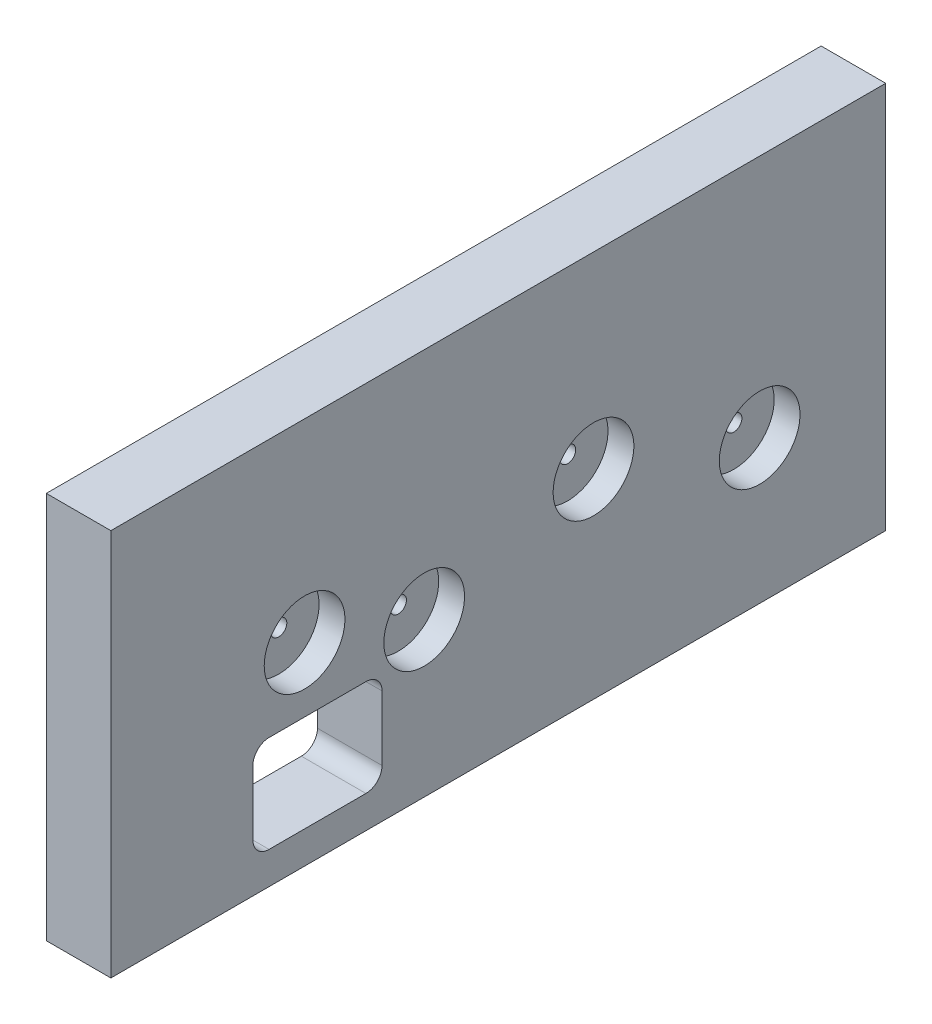
ISO-10303-21;
HEADER;
FILE_DESCRIPTION(('STEP AP214'),'2;1');
FILE_NAME('part.step','',(''),(''),'','','');
FILE_SCHEMA(('AUTOMOTIVE_DESIGN { 1 0 10303 214 1 1 1 1 }'));
ENDSEC;
DATA;
#1=APPLICATION_CONTEXT('core data for automotive mechanical design processes');
#2=APPLICATION_PROTOCOL_DEFINITION('international standard','automotive_design',2000,#1);
#3=PRODUCT_CONTEXT('',#1,'mechanical');
#4=PRODUCT('Part','Part','',(#3));
#5=PRODUCT_RELATED_PRODUCT_CATEGORY('part','',(#4));
#6=PRODUCT_DEFINITION_FORMATION('','',#4);
#7=PRODUCT_DEFINITION_CONTEXT('part definition',#1,'design');
#8=PRODUCT_DEFINITION('design','',#6,#7);
#9=PRODUCT_DEFINITION_SHAPE('','',#8);
#10=(LENGTH_UNIT() NAMED_UNIT(*) SI_UNIT(.MILLI.,.METRE.));
#11=(NAMED_UNIT(*) PLANE_ANGLE_UNIT() SI_UNIT($,.RADIAN.));
#12=(NAMED_UNIT(*) SI_UNIT($,.STERADIAN.) SOLID_ANGLE_UNIT());
#13=UNCERTAINTY_MEASURE_WITH_UNIT(LENGTH_MEASURE(1.E-05),#10,'distance_accuracy_value','');
#14=(GEOMETRIC_REPRESENTATION_CONTEXT(3) GLOBAL_UNCERTAINTY_ASSIGNED_CONTEXT((#13)) GLOBAL_UNIT_ASSIGNED_CONTEXT((#10,
#11,#12)) REPRESENTATION_CONTEXT('',''));
#15=CARTESIAN_POINT('',(0.,0.,0.));
#16=DIRECTION('',(0.,0.,1.));
#17=DIRECTION('',(1.,0.,0.));
#18=AXIS2_PLACEMENT_3D('',#15,#16,#17);
#19=CARTESIAN_POINT('',(12.7,-38.1,0.));
#20=DIRECTION('',(0.,1.,0.));
#21=DIRECTION('',(0.,0.,1.));
#22=AXIS2_PLACEMENT_3D('',#19,#20,#21);
#23=PLANE('',#22);
#24=CARTESIAN_POINT('',(6.35000000000001,-38.1,0.));
#25=DIRECTION('',(0.,-1.,0.));
#26=DIRECTION('',(0.,0.,-1.));
#27=AXIS2_PLACEMENT_3D('',#24,#25,#26);
#28=CIRCLE('',#27,3.175);
#29=CARTESIAN_POINT('',(6.35000000000001,-38.1,-3.175));
#30=VERTEX_POINT('',#29);
#31=EDGE_CURVE('E203',#30,#30,#28,.T.);
#32=ORIENTED_EDGE('',*,*,#31,.F.);
#33=EDGE_LOOP('',(#32));
#34=FACE_BOUND('',#33,.T.);
#35=CARTESIAN_POINT('',(6.35,-38.1,57.15));
#36=DIRECTION('',(0.,-1.,0.));
#37=DIRECTION('',(0.,0.,-1.));
#38=AXIS2_PLACEMENT_3D('',#35,#36,#37);
#39=CIRCLE('',#38,3.175);
#40=CARTESIAN_POINT('',(6.35,-38.1,53.975));
#41=VERTEX_POINT('',#40);
#42=EDGE_CURVE('E227',#41,#41,#39,.T.);
#43=ORIENTED_EDGE('',*,*,#42,.F.);
#44=EDGE_LOOP('',(#43));
#45=FACE_BOUND('',#44,.T.);
#46=CARTESIAN_POINT('',(6.35000000000002,-38.1,-63.5));
#47=DIRECTION('',(0.,-1.,0.));
#48=DIRECTION('',(0.,0.,-1.));
#49=AXIS2_PLACEMENT_3D('',#46,#47,#48);
#50=CIRCLE('',#49,3.175);
#51=CARTESIAN_POINT('',(6.35000000000002,-38.1,-66.675));
#52=VERTEX_POINT('',#51);
#53=EDGE_CURVE('E235',#52,#52,#50,.T.);
#54=ORIENTED_EDGE('',*,*,#53,.F.);
#55=EDGE_LOOP('',(#54));
#56=FACE_BOUND('',#55,.T.);
#57=DIRECTION('',(0.,0.,-1.));
#58=VECTOR('',#57,1.);
#59=CARTESIAN_POINT('',(0.,-38.1,0.));
#60=LINE('',#59,#58);
#61=CARTESIAN_POINT('',(0.,-38.1,76.2));
#62=VERTEX_POINT('',#61);
#63=CARTESIAN_POINT('',(0.,-38.1,-76.2));
#64=VERTEX_POINT('',#63);
#65=EDGE_CURVE('E293',#62,#64,#60,.T.);
#66=ORIENTED_EDGE('',*,*,#65,.T.);
#67=DIRECTION('',(-1.,0.,0.));
#68=VECTOR('',#67,1.);
#69=CARTESIAN_POINT('',(12.7,-38.1,-76.2));
#70=LINE('',#69,#68);
#71=CARTESIAN_POINT('',(12.7,-38.1,-76.2));
#72=VERTEX_POINT('',#71);
#73=EDGE_CURVE('E333',#72,#64,#70,.T.);
#74=ORIENTED_EDGE('',*,*,#73,.F.);
#75=DIRECTION('',(0.,0.,-1.));
#76=VECTOR('',#75,1.);
#77=CARTESIAN_POINT('',(12.7,-38.1,0.));
#78=LINE('',#77,#76);
#79=CARTESIAN_POINT('',(12.7,-38.1,76.2));
#80=VERTEX_POINT('',#79);
#81=EDGE_CURVE('E276',#80,#72,#78,.T.);
#82=ORIENTED_EDGE('',*,*,#81,.F.);
#83=DIRECTION('',(-1.,0.,0.));
#84=VECTOR('',#83,1.);
#85=CARTESIAN_POINT('',(12.7,-38.1,76.2));
#86=LINE('',#85,#84);
#87=EDGE_CURVE('E292',#80,#62,#86,.T.);
#88=ORIENTED_EDGE('',*,*,#87,.T.);
#89=EDGE_LOOP('',(#66,#74,#82,#88));
#90=FACE_BOUND('',#89,.T.);
#91=ADVANCED_FACE('F50',(#34,#45,#56,#90),#23,.F.);
#92=CARTESIAN_POINT('',(12.7,0.,-76.2));
#93=DIRECTION('',(0.,0.,1.));
#94=DIRECTION('',(1.,0.,0.));
#95=AXIS2_PLACEMENT_3D('',#92,#93,#94);
#96=PLANE('',#95);
#97=DIRECTION('',(0.,1.,0.));
#98=VECTOR('',#97,1.);
#99=CARTESIAN_POINT('',(0.,0.,-76.2));
#100=LINE('',#99,#98);
#101=CARTESIAN_POINT('',(0.,38.1,-76.2));
#102=VERTEX_POINT('',#101);
#103=EDGE_CURVE('E297',#64,#102,#100,.T.);
#104=ORIENTED_EDGE('',*,*,#103,.T.);
#105=DIRECTION('',(-1.,0.,0.));
#106=VECTOR('',#105,1.);
#107=CARTESIAN_POINT('',(12.7,38.1,-76.2));
#108=LINE('',#107,#106);
#109=CARTESIAN_POINT('',(12.7,38.1,-76.2));
#110=VERTEX_POINT('',#109);
#111=EDGE_CURVE('E330',#110,#102,#108,.T.);
#112=ORIENTED_EDGE('',*,*,#111,.F.);
#113=DIRECTION('',(0.,1.,0.));
#114=VECTOR('',#113,1.);
#115=CARTESIAN_POINT('',(12.7,0.,-76.2));
#116=LINE('',#115,#114);
#117=EDGE_CURVE('E280',#72,#110,#116,.T.);
#118=ORIENTED_EDGE('',*,*,#117,.F.);
#119=ORIENTED_EDGE('',*,*,#73,.T.);
#120=EDGE_LOOP('',(#104,#112,#118,#119));
#121=FACE_BOUND('',#120,.T.);
#122=ADVANCED_FACE('F411',(#121),#96,.F.);
#123=CARTESIAN_POINT('',(12.7,38.1,0.));
#124=DIRECTION('',(0.,1.,0.));
#125=DIRECTION('',(0.,0.,1.));
#126=AXIS2_PLACEMENT_3D('',#123,#124,#125);
#127=PLANE('',#126);
#128=DIRECTION('',(0.,0.,-1.));
#129=VECTOR('',#128,1.);
#130=CARTESIAN_POINT('',(0.,38.1,0.));
#131=LINE('',#130,#129);
#132=CARTESIAN_POINT('',(0.,38.1,76.2));
#133=VERTEX_POINT('',#132);
#134=EDGE_CURVE('E302',#133,#102,#131,.T.);
#135=ORIENTED_EDGE('',*,*,#134,.F.);
#136=DIRECTION('',(-1.,0.,0.));
#137=VECTOR('',#136,1.);
#138=CARTESIAN_POINT('',(12.7,38.1,76.2));
#139=LINE('',#138,#137);
#140=CARTESIAN_POINT('',(12.7,38.1,76.2));
#141=VERTEX_POINT('',#140);
#142=EDGE_CURVE('E327',#141,#133,#139,.T.);
#143=ORIENTED_EDGE('',*,*,#142,.F.);
#144=DIRECTION('',(0.,0.,-1.));
#145=VECTOR('',#144,1.);
#146=CARTESIAN_POINT('',(12.7,38.1,0.));
#147=LINE('',#146,#145);
#148=EDGE_CURVE('E284',#141,#110,#147,.T.);
#149=ORIENTED_EDGE('',*,*,#148,.T.);
#150=ORIENTED_EDGE('',*,*,#111,.T.);
#151=EDGE_LOOP('',(#135,#143,#149,#150));
#152=FACE_BOUND('',#151,.T.);
#153=ADVANCED_FACE('F417',(#152),#127,.T.);
#154=CARTESIAN_POINT('',(12.7,-9.873506971,-51.4082559918149));
#155=DIRECTION('',(-1.,0.,0.));
#156=DIRECTION('',(0.,0.,1.));
#157=AXIS2_PLACEMENT_3D('',#154,#155,#156);
#158=CYLINDRICAL_SURFACE('',#157,1.5875);
#159=CARTESIAN_POINT('',(7.62,-9.873506971,-51.4082559918149));
#160=DIRECTION('',(-1.,0.,0.));
#161=DIRECTION('',(0.,0.,1.));
#162=AXIS2_PLACEMENT_3D('',#159,#160,#161);
#163=CIRCLE('',#162,1.5875);
#164=CARTESIAN_POINT('',(7.62,-9.873506971,-49.8207559918149));
#165=VERTEX_POINT('',#164);
#166=EDGE_CURVE('E298',#165,#165,#163,.T.);
#167=ORIENTED_EDGE('',*,*,#166,.F.);
#168=EDGE_LOOP('',(#167));
#169=FACE_BOUND('',#168,.T.);
#170=CARTESIAN_POINT('',(0.,-9.873506971,-51.4082559918149));
#171=DIRECTION('',(1.,0.,0.));
#172=DIRECTION('',(0.,0.,-1.));
#173=AXIS2_PLACEMENT_3D('',#170,#171,#172);
#174=CIRCLE('',#173,1.5875);
#175=CARTESIAN_POINT('',(0.,-9.873506971,-52.9957559918149));
#176=VERTEX_POINT('',#175);
#177=EDGE_CURVE('E318',#176,#176,#174,.T.);
#178=ORIENTED_EDGE('',*,*,#177,.F.);
#179=EDGE_LOOP('',(#178));
#180=FACE_BOUND('',#179,.T.);
#181=ADVANCED_FACE('F451',(#169,#180),#158,.F.);
#182=CARTESIAN_POINT('',(12.7,1.096077429,-18.7225315801618));
#183=DIRECTION('',(-1.,0.,0.));
#184=DIRECTION('',(0.,0.,1.));
#185=AXIS2_PLACEMENT_3D('',#182,#183,#184);
#186=CYLINDRICAL_SURFACE('',#185,1.5875);
#187=CARTESIAN_POINT('',(7.62,1.096077429,-18.7225315801618));
#188=DIRECTION('',(-1.,0.,0.));
#189=DIRECTION('',(0.,0.,1.));
#190=AXIS2_PLACEMENT_3D('',#187,#188,#189);
#191=CIRCLE('',#190,1.5875);
#192=CARTESIAN_POINT('',(7.62,1.096077429,-17.1350315801618));
#193=VERTEX_POINT('',#192);
#194=EDGE_CURVE('E345',#193,#193,#191,.T.);
#195=ORIENTED_EDGE('',*,*,#194,.F.);
#196=EDGE_LOOP('',(#195));
#197=FACE_BOUND('',#196,.T.);
#198=CARTESIAN_POINT('',(0.,1.096077429,-18.7225315801618));
#199=DIRECTION('',(1.,0.,0.));
#200=DIRECTION('',(0.,0.,-1.));
#201=AXIS2_PLACEMENT_3D('',#198,#199,#200);
#202=CIRCLE('',#201,1.5875);
#203=CARTESIAN_POINT('',(0.,1.096077429,-20.3100315801618));
#204=VERTEX_POINT('',#203);
#205=EDGE_CURVE('E314',#204,#204,#202,.T.);
#206=ORIENTED_EDGE('',*,*,#205,.F.);
#207=EDGE_LOOP('',(#206));
#208=FACE_BOUND('',#207,.T.);
#209=ADVANCED_FACE('F454',(#197,#208),#186,.F.);
#210=CARTESIAN_POINT('',(12.7,0.,38.1));
#211=DIRECTION('',(-1.,0.,0.));
#212=DIRECTION('',(0.,0.,1.));
#213=AXIS2_PLACEMENT_3D('',#210,#211,#212);
#214=CYLINDRICAL_SURFACE('',#213,1.5875);
#215=CARTESIAN_POINT('',(7.62,0.,38.1));
#216=DIRECTION('',(-1.,0.,0.));
#217=DIRECTION('',(0.,0.,1.));
#218=AXIS2_PLACEMENT_3D('',#215,#216,#217);
#219=CIRCLE('',#218,1.5875);
#220=CARTESIAN_POINT('',(7.62,0.,39.6875));
#221=VERTEX_POINT('',#220);
#222=EDGE_CURVE('E341',#221,#221,#219,.T.);
#223=ORIENTED_EDGE('',*,*,#222,.F.);
#224=EDGE_LOOP('',(#223));
#225=FACE_BOUND('',#224,.T.);
#226=CARTESIAN_POINT('',(0.,0.,38.1));
#227=DIRECTION('',(1.,0.,0.));
#228=DIRECTION('',(0.,0.,-1.));
#229=AXIS2_PLACEMENT_3D('',#226,#227,#228);
#230=CIRCLE('',#229,1.5875);
#231=CARTESIAN_POINT('',(0.,0.,36.5125));
#232=VERTEX_POINT('',#231);
#233=EDGE_CURVE('E310',#232,#232,#230,.T.);
#234=ORIENTED_EDGE('',*,*,#233,.F.);
#235=EDGE_LOOP('',(#234));
#236=FACE_BOUND('',#235,.T.);
#237=ADVANCED_FACE('F458',(#225,#236),#214,.F.);
#238=CARTESIAN_POINT('',(12.7,0.,76.2));
#239=DIRECTION('',(0.,0.,1.));
#240=DIRECTION('',(1.,0.,0.));
#241=AXIS2_PLACEMENT_3D('',#238,#239,#240);
#242=PLANE('',#241);
#243=DIRECTION('',(0.,1.,0.));
#244=VECTOR('',#243,1.);
#245=CARTESIAN_POINT('',(0.,0.,76.2));
#246=LINE('',#245,#244);
#247=EDGE_CURVE('E306',#62,#133,#246,.T.);
#248=ORIENTED_EDGE('',*,*,#247,.F.);
#249=ORIENTED_EDGE('',*,*,#87,.F.);
#250=DIRECTION('',(0.,1.,0.));
#251=VECTOR('',#250,1.);
#252=CARTESIAN_POINT('',(12.7,0.,76.2));
#253=LINE('',#252,#251);
#254=EDGE_CURVE('E288',#80,#141,#253,.T.);
#255=ORIENTED_EDGE('',*,*,#254,.T.);
#256=ORIENTED_EDGE('',*,*,#142,.T.);
#257=EDGE_LOOP('',(#248,#249,#255,#256));
#258=FACE_BOUND('',#257,.T.);
#259=ADVANCED_FACE('F431',(#258),#242,.T.);
#260=CARTESIAN_POINT('',(12.7,-7.860160654,14.5712240149026));
#261=DIRECTION('',(-1.,0.,0.));
#262=DIRECTION('',(0.,0.,1.));
#263=AXIS2_PLACEMENT_3D('',#260,#261,#262);
#264=CYLINDRICAL_SURFACE('',#263,1.5875);
#265=CARTESIAN_POINT('',(7.62,-7.860160654,14.5712240149026));
#266=DIRECTION('',(-1.,0.,0.));
#267=DIRECTION('',(0.,0.,1.));
#268=AXIS2_PLACEMENT_3D('',#265,#266,#267);
#269=CIRCLE('',#268,1.5875);
#270=CARTESIAN_POINT('',(7.62,-7.860160654,16.1587240149026));
#271=VERTEX_POINT('',#270);
#272=EDGE_CURVE('E248',#271,#271,#269,.T.);
#273=ORIENTED_EDGE('',*,*,#272,.F.);
#274=EDGE_LOOP('',(#273));
#275=FACE_BOUND('',#274,.T.);
#276=CARTESIAN_POINT('',(0.,-7.860160654,14.5712240149026));
#277=DIRECTION('',(1.,0.,0.));
#278=DIRECTION('',(0.,0.,-1.));
#279=AXIS2_PLACEMENT_3D('',#276,#277,#278);
#280=CIRCLE('',#279,1.5875);
#281=CARTESIAN_POINT('',(0.,-7.860160654,12.9837240149026));
#282=VERTEX_POINT('',#281);
#283=EDGE_CURVE('E281',#282,#282,#280,.T.);
#284=ORIENTED_EDGE('',*,*,#283,.F.);
#285=EDGE_LOOP('',(#284));
#286=FACE_BOUND('',#285,.T.);
#287=ADVANCED_FACE('F438',(#275,#286),#264,.F.);
#288=CARTESIAN_POINT('',(12.7,0.,0.));
#289=DIRECTION('',(1.,0.,0.));
#290=DIRECTION('',(0.,0.,-1.));
#291=AXIS2_PLACEMENT_3D('',#288,#289,#290);
#292=PLANE('',#291);
#293=CARTESIAN_POINT('',(12.7,-28.575,26.035));
#294=DIRECTION('',(1.,0.,0.));
#295=DIRECTION('',(0.,0.,-1.));
#296=AXIS2_PLACEMENT_3D('',#293,#294,#295);
#297=CIRCLE('',#296,3.175);
#298=CARTESIAN_POINT('',(12.7,-31.75,26.035));
#299=VERTEX_POINT('',#298);
#300=CARTESIAN_POINT('',(12.7,-28.575,22.86));
#301=VERTEX_POINT('',#300);
#302=EDGE_CURVE('E65',#299,#301,#297,.T.);
#303=ORIENTED_EDGE('',*,*,#302,.F.);
#304=DIRECTION('',(0.,0.,-1.));
#305=VECTOR('',#304,1.);
#306=CARTESIAN_POINT('',(12.7,-31.75,45.085));
#307=LINE('',#306,#305);
#308=CARTESIAN_POINT('',(12.7,-31.75,45.085));
#309=VERTEX_POINT('',#308);
#310=EDGE_CURVE('E196',#309,#299,#307,.T.);
#311=ORIENTED_EDGE('',*,*,#310,.F.);
#312=CARTESIAN_POINT('',(12.7,-28.575,45.085));
#313=DIRECTION('',(1.,0.,0.));
#314=DIRECTION('',(0.,0.,-1.));
#315=AXIS2_PLACEMENT_3D('',#312,#313,#314);
#316=CIRCLE('',#315,3.175);
#317=CARTESIAN_POINT('',(12.7,-28.575,48.26));
#318=VERTEX_POINT('',#317);
#319=EDGE_CURVE('E192',#318,#309,#316,.T.);
#320=ORIENTED_EDGE('',*,*,#319,.F.);
#321=DIRECTION('',(0.,-1.,0.));
#322=VECTOR('',#321,1.);
#323=CARTESIAN_POINT('',(12.7,-15.875,48.26));
#324=LINE('',#323,#322);
#325=CARTESIAN_POINT('',(12.7,-15.875,48.26));
#326=VERTEX_POINT('',#325);
#327=EDGE_CURVE('E188',#326,#318,#324,.T.);
#328=ORIENTED_EDGE('',*,*,#327,.F.);
#329=CARTESIAN_POINT('',(12.7,-15.875,45.085));
#330=DIRECTION('',(1.,0.,0.));
#331=DIRECTION('',(0.,0.,-1.));
#332=AXIS2_PLACEMENT_3D('',#329,#330,#331);
#333=CIRCLE('',#332,3.175);
#334=CARTESIAN_POINT('',(12.7,-12.7,45.085));
#335=VERTEX_POINT('',#334);
#336=EDGE_CURVE('E181',#335,#326,#333,.T.);
#337=ORIENTED_EDGE('',*,*,#336,.F.);
#338=DIRECTION('',(0.,0.,1.));
#339=VECTOR('',#338,1.);
#340=CARTESIAN_POINT('',(12.7,-12.7,45.085));
#341=LINE('',#340,#339);
#342=CARTESIAN_POINT('',(12.7,-12.7,26.035));
#343=VERTEX_POINT('',#342);
#344=EDGE_CURVE('E177',#343,#335,#341,.T.);
#345=ORIENTED_EDGE('',*,*,#344,.F.);
#346=CARTESIAN_POINT('',(12.7,-15.875,26.035));
#347=DIRECTION('',(1.,0.,0.));
#348=DIRECTION('',(0.,0.,1.));
#349=AXIS2_PLACEMENT_3D('',#346,#347,#348);
#350=CIRCLE('',#349,3.175);
#351=CARTESIAN_POINT('',(12.7,-15.875,22.86));
#352=VERTEX_POINT('',#351);
#353=EDGE_CURVE('E158',#352,#343,#350,.T.);
#354=ORIENTED_EDGE('',*,*,#353,.F.);
#355=DIRECTION('',(0.,1.,0.));
#356=VECTOR('',#355,1.);
#357=CARTESIAN_POINT('',(12.7,-15.875,22.86));
#358=LINE('',#357,#356);
#359=EDGE_CURVE('E168',#301,#352,#358,.T.);
#360=ORIENTED_EDGE('',*,*,#359,.F.);
#361=EDGE_LOOP('',(#303,#311,#320,#328,#337,#345,#354,#360));
#362=FACE_BOUND('',#361,.T.);
#363=CARTESIAN_POINT('',(12.7,0.,38.1));
#364=DIRECTION('',(-1.,0.,0.));
#365=DIRECTION('',(0.,0.,1.));
#366=AXIS2_PLACEMENT_3D('',#363,#364,#365);
#367=CIRCLE('',#366,7.9375);
#368=CARTESIAN_POINT('',(12.7,0.,46.0375));
#369=VERTEX_POINT('',#368);
#370=EDGE_CURVE('E249',#369,#369,#367,.T.);
#371=ORIENTED_EDGE('',*,*,#370,.T.);
#372=EDGE_LOOP('',(#371));
#373=FACE_BOUND('',#372,.T.);
#374=CARTESIAN_POINT('',(12.7,-7.860160654,14.5712240149026));
#375=DIRECTION('',(-1.,0.,0.));
#376=DIRECTION('',(0.,0.,1.));
#377=AXIS2_PLACEMENT_3D('',#374,#375,#376);
#378=CIRCLE('',#377,7.9375);
#379=CARTESIAN_POINT('',(12.7,-7.860160654,22.5087240149026));
#380=VERTEX_POINT('',#379);
#381=EDGE_CURVE('E253',#380,#380,#378,.T.);
#382=ORIENTED_EDGE('',*,*,#381,.T.);
#383=EDGE_LOOP('',(#382));
#384=FACE_BOUND('',#383,.T.);
#385=CARTESIAN_POINT('',(12.7,1.096077429,-18.7225315801618));
#386=DIRECTION('',(-1.,0.,0.));
#387=DIRECTION('',(0.,0.,1.));
#388=AXIS2_PLACEMENT_3D('',#385,#386,#387);
#389=CIRCLE('',#388,7.9375);
#390=CARTESIAN_POINT('',(12.7,1.096077429,-10.7850315801618));
#391=VERTEX_POINT('',#390);
#392=EDGE_CURVE('E261',#391,#391,#389,.T.);
#393=ORIENTED_EDGE('',*,*,#392,.T.);
#394=EDGE_LOOP('',(#393));
#395=FACE_BOUND('',#394,.T.);
#396=CARTESIAN_POINT('',(12.7,-9.873506971,-51.4082559918149));
#397=DIRECTION('',(-1.,0.,0.));
#398=DIRECTION('',(0.,0.,1.));
#399=AXIS2_PLACEMENT_3D('',#396,#397,#398);
#400=CIRCLE('',#399,7.9375);
#401=CARTESIAN_POINT('',(12.7,-9.873506971,-43.4707559918149));
#402=VERTEX_POINT('',#401);
#403=EDGE_CURVE('E269',#402,#402,#400,.T.);
#404=ORIENTED_EDGE('',*,*,#403,.T.);
#405=EDGE_LOOP('',(#404));
#406=FACE_BOUND('',#405,.T.);
#407=ORIENTED_EDGE('',*,*,#81,.T.);
#408=ORIENTED_EDGE('',*,*,#117,.T.);
#409=ORIENTED_EDGE('',*,*,#148,.F.);
#410=ORIENTED_EDGE('',*,*,#254,.F.);
#411=EDGE_LOOP('',(#407,#408,#409,#410));
#412=FACE_BOUND('',#411,.T.);
#413=ADVANCED_FACE('F173',(#362,#373,#384,#395,#406,#412),#292,.T.);
#414=CARTESIAN_POINT('',(0.,0.,0.));
#415=DIRECTION('',(1.,0.,0.));
#416=DIRECTION('',(0.,0.,-1.));
#417=AXIS2_PLACEMENT_3D('',#414,#415,#416);
#418=PLANE('',#417);
#419=DIRECTION('',(0.,0.,-1.));
#420=VECTOR('',#419,1.);
#421=CARTESIAN_POINT('',(0.,-31.75,0.));
#422=LINE('',#421,#420);
#423=CARTESIAN_POINT('',(0.,-31.75,45.085));
#424=VERTEX_POINT('',#423);
#425=CARTESIAN_POINT('',(0.,-31.75,26.035));
#426=VERTEX_POINT('',#425);
#427=EDGE_CURVE('E58',#424,#426,#422,.T.);
#428=ORIENTED_EDGE('',*,*,#427,.T.);
#429=CARTESIAN_POINT('',(0.,-28.575,26.035));
#430=DIRECTION('',(1.,0.,0.));
#431=DIRECTION('',(0.,0.,-1.));
#432=AXIS2_PLACEMENT_3D('',#429,#430,#431);
#433=CIRCLE('',#432,3.175);
#434=CARTESIAN_POINT('',(0.,-28.575,22.86));
#435=VERTEX_POINT('',#434);
#436=EDGE_CURVE('E11',#426,#435,#433,.T.);
#437=ORIENTED_EDGE('',*,*,#436,.T.);
#438=DIRECTION('',(0.,1.,0.));
#439=VECTOR('',#438,1.);
#440=CARTESIAN_POINT('',(0.,0.,22.86));
#441=LINE('',#440,#439);
#442=CARTESIAN_POINT('',(0.,-15.875,22.86));
#443=VERTEX_POINT('',#442);
#444=EDGE_CURVE('E337',#435,#443,#441,.T.);
#445=ORIENTED_EDGE('',*,*,#444,.T.);
#446=CARTESIAN_POINT('',(0.,-15.875,26.035));
#447=DIRECTION('',(1.,0.,0.));
#448=DIRECTION('',(0.,0.,-1.));
#449=AXIS2_PLACEMENT_3D('',#446,#447,#448);
#450=CIRCLE('',#449,3.175);
#451=CARTESIAN_POINT('',(0.,-12.7,26.035));
#452=VERTEX_POINT('',#451);
#453=EDGE_CURVE('E161',#443,#452,#450,.T.);
#454=ORIENTED_EDGE('',*,*,#453,.T.);
#455=DIRECTION('',(0.,0.,1.));
#456=VECTOR('',#455,1.);
#457=CARTESIAN_POINT('',(0.,-12.7,0.));
#458=LINE('',#457,#456);
#459=CARTESIAN_POINT('',(0.,-12.7,45.085));
#460=VERTEX_POINT('',#459);
#461=EDGE_CURVE('E356',#452,#460,#458,.T.);
#462=ORIENTED_EDGE('',*,*,#461,.T.);
#463=CARTESIAN_POINT('',(0.,-15.875,45.085));
#464=DIRECTION('',(1.,0.,0.));
#465=DIRECTION('',(0.,0.,-1.));
#466=AXIS2_PLACEMENT_3D('',#463,#464,#465);
#467=CIRCLE('',#466,3.175);
#468=CARTESIAN_POINT('',(0.,-15.875,48.26));
#469=VERTEX_POINT('',#468);
#470=EDGE_CURVE('E360',#460,#469,#467,.T.);
#471=ORIENTED_EDGE('',*,*,#470,.T.);
#472=DIRECTION('',(0.,-1.,0.));
#473=VECTOR('',#472,1.);
#474=CARTESIAN_POINT('',(0.,0.,48.26));
#475=LINE('',#474,#473);
#476=CARTESIAN_POINT('',(0.,-28.575,48.26));
#477=VERTEX_POINT('',#476);
#478=EDGE_CURVE('E364',#469,#477,#475,.T.);
#479=ORIENTED_EDGE('',*,*,#478,.T.);
#480=CARTESIAN_POINT('',(0.,-28.575,45.085));
#481=DIRECTION('',(1.,0.,0.));
#482=DIRECTION('',(0.,0.,-1.));
#483=AXIS2_PLACEMENT_3D('',#480,#481,#482);
#484=CIRCLE('',#483,3.175);
#485=EDGE_CURVE('E368',#477,#424,#484,.T.);
#486=ORIENTED_EDGE('',*,*,#485,.T.);
#487=EDGE_LOOP('',(#428,#437,#445,#454,#462,#471,#479,#486));
#488=FACE_BOUND('',#487,.T.);
#489=ORIENTED_EDGE('',*,*,#65,.F.);
#490=ORIENTED_EDGE('',*,*,#247,.T.);
#491=ORIENTED_EDGE('',*,*,#134,.T.);
#492=ORIENTED_EDGE('',*,*,#103,.F.);
#493=EDGE_LOOP('',(#489,#490,#491,#492));
#494=FACE_BOUND('',#493,.T.);
#495=ORIENTED_EDGE('',*,*,#233,.T.);
#496=EDGE_LOOP('',(#495));
#497=FACE_BOUND('',#496,.T.);
#498=ORIENTED_EDGE('',*,*,#205,.T.);
#499=EDGE_LOOP('',(#498));
#500=FACE_BOUND('',#499,.T.);
#501=ORIENTED_EDGE('',*,*,#177,.T.);
#502=EDGE_LOOP('',(#501));
#503=FACE_BOUND('',#502,.T.);
#504=ORIENTED_EDGE('',*,*,#283,.T.);
#505=EDGE_LOOP('',(#504));
#506=FACE_BOUND('',#505,.T.);
#507=ADVANCED_FACE('F374',(#488,#494,#497,#500,#503,#506),#418,.F.);
#508=CARTESIAN_POINT('',(7.62,-9.873506971,-51.4082559918149));
#509=DIRECTION('',(1.,0.,0.));
#510=DIRECTION('',(0.,0.,-1.));
#511=AXIS2_PLACEMENT_3D('',#508,#509,#510);
#512=CYLINDRICAL_SURFACE('',#511,7.9375);
#513=CARTESIAN_POINT('',(7.62,-9.873506971,-51.4082559918149));
#514=DIRECTION('',(-1.,0.,0.));
#515=DIRECTION('',(0.,0.,1.));
#516=AXIS2_PLACEMENT_3D('',#513,#514,#515);
#517=CIRCLE('',#516,7.9375);
#518=CARTESIAN_POINT('',(7.62,-9.873506971,-43.4707559918149));
#519=VERTEX_POINT('',#518);
#520=EDGE_CURVE('E243',#519,#519,#517,.T.);
#521=ORIENTED_EDGE('',*,*,#520,.T.);
#522=EDGE_LOOP('',(#521));
#523=FACE_BOUND('',#522,.T.);
#524=ORIENTED_EDGE('',*,*,#403,.F.);
#525=EDGE_LOOP('',(#524));
#526=FACE_BOUND('',#525,.T.);
#527=ADVANCED_FACE('F442',(#523,#526),#512,.F.);
#528=CARTESIAN_POINT('',(7.62,-9.873506971,-51.4082559918149));
#529=DIRECTION('',(-1.,0.,0.));
#530=DIRECTION('',(0.,0.,1.));
#531=AXIS2_PLACEMENT_3D('',#528,#529,#530);
#532=PLANE('',#531);
#533=ORIENTED_EDGE('',*,*,#166,.T.);
#534=EDGE_LOOP('',(#533));
#535=FACE_BOUND('',#534,.T.);
#536=ORIENTED_EDGE('',*,*,#520,.F.);
#537=EDGE_LOOP('',(#536));
#538=FACE_BOUND('',#537,.T.);
#539=ADVANCED_FACE('F448',(#535,#538),#532,.F.);
#540=CARTESIAN_POINT('',(7.62,1.096077429,-18.7225315801618));
#541=DIRECTION('',(1.,0.,0.));
#542=DIRECTION('',(0.,0.,-1.));
#543=AXIS2_PLACEMENT_3D('',#540,#541,#542);
#544=CYLINDRICAL_SURFACE('',#543,7.9375);
#545=CARTESIAN_POINT('',(7.62,1.096077429,-18.7225315801618));
#546=DIRECTION('',(-1.,0.,0.));
#547=DIRECTION('',(0.,0.,1.));
#548=AXIS2_PLACEMENT_3D('',#545,#546,#547);
#549=CIRCLE('',#548,7.9375);
#550=CARTESIAN_POINT('',(7.62,1.096077429,-10.7850315801618));
#551=VERTEX_POINT('',#550);
#552=EDGE_CURVE('E265',#551,#551,#549,.T.);
#553=ORIENTED_EDGE('',*,*,#552,.T.);
#554=EDGE_LOOP('',(#553));
#555=FACE_BOUND('',#554,.T.);
#556=ORIENTED_EDGE('',*,*,#392,.F.);
#557=EDGE_LOOP('',(#556));
#558=FACE_BOUND('',#557,.T.);
#559=ADVANCED_FACE('F614',(#555,#558),#544,.F.);
#560=CARTESIAN_POINT('',(7.62,1.096077429,-18.7225315801618));
#561=DIRECTION('',(-1.,0.,0.));
#562=DIRECTION('',(0.,0.,1.));
#563=AXIS2_PLACEMENT_3D('',#560,#561,#562);
#564=PLANE('',#563);
#565=ORIENTED_EDGE('',*,*,#194,.T.);
#566=EDGE_LOOP('',(#565));
#567=FACE_BOUND('',#566,.T.);
#568=ORIENTED_EDGE('',*,*,#552,.F.);
#569=EDGE_LOOP('',(#568));
#570=FACE_BOUND('',#569,.T.);
#571=ADVANCED_FACE('F623',(#567,#570),#564,.F.);
#572=CARTESIAN_POINT('',(7.62,-7.860160654,14.5712240149026));
#573=DIRECTION('',(1.,0.,0.));
#574=DIRECTION('',(0.,0.,-1.));
#575=AXIS2_PLACEMENT_3D('',#572,#573,#574);
#576=CYLINDRICAL_SURFACE('',#575,7.9375);
#577=CARTESIAN_POINT('',(7.62,-7.860160654,14.5712240149026));
#578=DIRECTION('',(-1.,0.,0.));
#579=DIRECTION('',(0.,0.,1.));
#580=AXIS2_PLACEMENT_3D('',#577,#578,#579);
#581=CIRCLE('',#580,7.9375);
#582=CARTESIAN_POINT('',(7.62,-7.860160654,22.5087240149026));
#583=VERTEX_POINT('',#582);
#584=EDGE_CURVE('E257',#583,#583,#581,.T.);
#585=ORIENTED_EDGE('',*,*,#584,.T.);
#586=EDGE_LOOP('',(#585));
#587=FACE_BOUND('',#586,.T.);
#588=ORIENTED_EDGE('',*,*,#381,.F.);
#589=EDGE_LOOP('',(#588));
#590=FACE_BOUND('',#589,.T.);
#591=ADVANCED_FACE('F633',(#587,#590),#576,.F.);
#592=CARTESIAN_POINT('',(7.62,-7.860160654,14.5712240149026));
#593=DIRECTION('',(-1.,0.,0.));
#594=DIRECTION('',(0.,0.,1.));
#595=AXIS2_PLACEMENT_3D('',#592,#593,#594);
#596=PLANE('',#595);
#597=ORIENTED_EDGE('',*,*,#272,.T.);
#598=EDGE_LOOP('',(#597));
#599=FACE_BOUND('',#598,.T.);
#600=ORIENTED_EDGE('',*,*,#584,.F.);
#601=EDGE_LOOP('',(#600));
#602=FACE_BOUND('',#601,.T.);
#603=ADVANCED_FACE('F643',(#599,#602),#596,.F.);
#604=CARTESIAN_POINT('',(7.62,0.,38.1));
#605=DIRECTION('',(1.,0.,0.));
#606=DIRECTION('',(0.,0.,-1.));
#607=AXIS2_PLACEMENT_3D('',#604,#605,#606);
#608=CYLINDRICAL_SURFACE('',#607,7.9375);
#609=CARTESIAN_POINT('',(7.62,0.,38.1));
#610=DIRECTION('',(-1.,0.,0.));
#611=DIRECTION('',(0.,0.,1.));
#612=AXIS2_PLACEMENT_3D('',#609,#610,#611);
#613=CIRCLE('',#612,7.9375);
#614=CARTESIAN_POINT('',(7.62,0.,46.0375));
#615=VERTEX_POINT('',#614);
#616=EDGE_CURVE('E244',#615,#615,#613,.T.);
#617=ORIENTED_EDGE('',*,*,#616,.T.);
#618=EDGE_LOOP('',(#617));
#619=FACE_BOUND('',#618,.T.);
#620=ORIENTED_EDGE('',*,*,#370,.F.);
#621=EDGE_LOOP('',(#620));
#622=FACE_BOUND('',#621,.T.);
#623=ADVANCED_FACE('F653',(#619,#622),#608,.F.);
#624=CARTESIAN_POINT('',(7.62,0.,38.1));
#625=DIRECTION('',(-1.,0.,0.));
#626=DIRECTION('',(0.,0.,1.));
#627=AXIS2_PLACEMENT_3D('',#624,#625,#626);
#628=PLANE('',#627);
#629=ORIENTED_EDGE('',*,*,#222,.T.);
#630=EDGE_LOOP('',(#629));
#631=FACE_BOUND('',#630,.T.);
#632=ORIENTED_EDGE('',*,*,#616,.F.);
#633=EDGE_LOOP('',(#632));
#634=FACE_BOUND('',#633,.T.);
#635=ADVANCED_FACE('F663',(#631,#634),#628,.F.);
#636=CARTESIAN_POINT('',(6.35000000000002,0.,-63.5));
#637=DIRECTION('',(0.,-1.,0.));
#638=DIRECTION('',(0.,0.,-1.));
#639=AXIS2_PLACEMENT_3D('',#636,#637,#638);
#640=CONICAL_SURFACE('',#639,3.17499999999999,1.02974425867665);
#641=CARTESIAN_POINT('',(6.35000000000001,1.9077324654125,-63.5));
#642=VERTEX_POINT('',#641);
#643=VERTEX_LOOP('',#642);
#644=FACE_BOUND('',#643,.T.);
#645=CARTESIAN_POINT('',(6.35000000000002,0.,-63.5));
#646=DIRECTION('',(0.,-1.,0.));
#647=DIRECTION('',(0.,0.,-1.));
#648=AXIS2_PLACEMENT_3D('',#645,#646,#647);
#649=CIRCLE('',#648,3.17499999999999);
#650=CARTESIAN_POINT('',(6.35000000000002,0.,-66.675));
#651=VERTEX_POINT('',#650);
#652=EDGE_CURVE('E239',#651,#651,#649,.T.);
#653=ORIENTED_EDGE('',*,*,#652,.T.);
#654=EDGE_LOOP('',(#653));
#655=FACE_BOUND('',#654,.T.);
#656=ADVANCED_FACE('F673',(#644,#655),#640,.F.);
#657=CARTESIAN_POINT('',(6.35000000000002,-38.1,-63.5));
#658=DIRECTION('',(0.,-1.,0.));
#659=DIRECTION('',(0.,0.,-1.));
#660=AXIS2_PLACEMENT_3D('',#657,#658,#659);
#661=CYLINDRICAL_SURFACE('',#660,3.17499999999999);
#662=ORIENTED_EDGE('',*,*,#652,.F.);
#663=EDGE_LOOP('',(#662));
#664=FACE_BOUND('',#663,.T.);
#665=ORIENTED_EDGE('',*,*,#53,.T.);
#666=EDGE_LOOP('',(#665));
#667=FACE_BOUND('',#666,.T.);
#668=ADVANCED_FACE('F683',(#664,#667),#661,.F.);
#669=CARTESIAN_POINT('',(6.35,0.,57.15));
#670=DIRECTION('',(0.,-1.,0.));
#671=DIRECTION('',(0.,0.,-1.));
#672=AXIS2_PLACEMENT_3D('',#669,#670,#671);
#673=CONICAL_SURFACE('',#672,3.17499999999999,1.02974425867665);
#674=CARTESIAN_POINT('',(6.34999999999999,1.9077324654125,57.15));
#675=VERTEX_POINT('',#674);
#676=VERTEX_LOOP('',#675);
#677=FACE_BOUND('',#676,.T.);
#678=CARTESIAN_POINT('',(6.35,0.,57.15));
#679=DIRECTION('',(0.,-1.,0.));
#680=DIRECTION('',(0.,0.,-1.));
#681=AXIS2_PLACEMENT_3D('',#678,#679,#680);
#682=CIRCLE('',#681,3.17499999999999);
#683=CARTESIAN_POINT('',(6.35,0.,53.975));
#684=VERTEX_POINT('',#683);
#685=EDGE_CURVE('E231',#684,#684,#682,.T.);
#686=ORIENTED_EDGE('',*,*,#685,.T.);
#687=EDGE_LOOP('',(#686));
#688=FACE_BOUND('',#687,.T.);
#689=ADVANCED_FACE('F473',(#677,#688),#673,.F.);
#690=CARTESIAN_POINT('',(6.35,-38.1,57.15));
#691=DIRECTION('',(0.,-1.,0.));
#692=DIRECTION('',(0.,0.,-1.));
#693=AXIS2_PLACEMENT_3D('',#690,#691,#692);
#694=CYLINDRICAL_SURFACE('',#693,3.175);
#695=ORIENTED_EDGE('',*,*,#685,.F.);
#696=EDGE_LOOP('',(#695));
#697=FACE_BOUND('',#696,.T.);
#698=ORIENTED_EDGE('',*,*,#42,.T.);
#699=EDGE_LOOP('',(#698));
#700=FACE_BOUND('',#699,.T.);
#701=ADVANCED_FACE('F701',(#697,#700),#694,.F.);
#702=CARTESIAN_POINT('',(6.35000000000001,0.,0.));
#703=DIRECTION('',(0.,-1.,0.));
#704=DIRECTION('',(0.,0.,-1.));
#705=AXIS2_PLACEMENT_3D('',#702,#703,#704);
#706=CONICAL_SURFACE('',#705,3.17499999999999,1.02974425867665);
#707=CARTESIAN_POINT('',(6.35,1.9077324654125,0.));
#708=VERTEX_POINT('',#707);
#709=VERTEX_LOOP('',#708);
#710=FACE_BOUND('',#709,.T.);
#711=CARTESIAN_POINT('',(6.35000000000001,0.,0.));
#712=DIRECTION('',(0.,-1.,0.));
#713=DIRECTION('',(0.,0.,-1.));
#714=AXIS2_PLACEMENT_3D('',#711,#712,#713);
#715=CIRCLE('',#714,3.17499999999999);
#716=CARTESIAN_POINT('',(6.35000000000001,0.,-3.17499999999999));
#717=VERTEX_POINT('',#716);
#718=EDGE_CURVE('E223',#717,#717,#715,.T.);
#719=ORIENTED_EDGE('',*,*,#718,.T.);
#720=EDGE_LOOP('',(#719));
#721=FACE_BOUND('',#720,.T.);
#722=ADVANCED_FACE('F406',(#710,#721),#706,.F.);
#723=CARTESIAN_POINT('',(6.35000000000001,-38.1,0.));
#724=DIRECTION('',(0.,-1.,0.));
#725=DIRECTION('',(0.,0.,-1.));
#726=AXIS2_PLACEMENT_3D('',#723,#724,#725);
#727=CYLINDRICAL_SURFACE('',#726,3.175);
#728=ORIENTED_EDGE('',*,*,#718,.F.);
#729=EDGE_LOOP('',(#728));
#730=FACE_BOUND('',#729,.T.);
#731=ORIENTED_EDGE('',*,*,#31,.T.);
#732=EDGE_LOOP('',(#731));
#733=FACE_BOUND('',#732,.T.);
#734=ADVANCED_FACE('F397',(#730,#733),#727,.F.);
#735=CARTESIAN_POINT('',(-12.7,-28.575,26.035));
#736=DIRECTION('',(1.,0.,0.));
#737=DIRECTION('',(0.,0.,-1.));
#738=AXIS2_PLACEMENT_3D('',#735,#736,#737);
#739=CYLINDRICAL_SURFACE('',#738,3.175);
#740=DIRECTION('',(1.,0.,0.));
#741=VECTOR('',#740,1.);
#742=CARTESIAN_POINT('',(-12.7,-31.75,26.035));
#743=LINE('',#742,#741);
#744=EDGE_CURVE('E200',#426,#299,#743,.T.);
#745=ORIENTED_EDGE('',*,*,#744,.T.);
#746=ORIENTED_EDGE('',*,*,#302,.T.);
#747=DIRECTION('',(1.,0.,0.));
#748=VECTOR('',#747,1.);
#749=CARTESIAN_POINT('',(-12.7,-28.575,22.86));
#750=LINE('',#749,#748);
#751=EDGE_CURVE('E165',#435,#301,#750,.T.);
#752=ORIENTED_EDGE('',*,*,#751,.F.);
#753=ORIENTED_EDGE('',*,*,#436,.F.);
#754=EDGE_LOOP('',(#745,#746,#752,#753));
#755=FACE_BOUND('',#754,.T.);
#756=ADVANCED_FACE('F395',(#755),#739,.F.);
#757=CARTESIAN_POINT('',(-12.7,-31.75,45.085));
#758=DIRECTION('',(0.,-1.,0.));
#759=DIRECTION('',(0.,0.,-1.));
#760=AXIS2_PLACEMENT_3D('',#757,#758,#759);
#761=PLANE('',#760);
#762=DIRECTION('',(1.,0.,0.));
#763=VECTOR('',#762,1.);
#764=CARTESIAN_POINT('',(-12.7,-31.75,45.085));
#765=LINE('',#764,#763);
#766=EDGE_CURVE('E204',#424,#309,#765,.T.);
#767=ORIENTED_EDGE('',*,*,#766,.T.);
#768=ORIENTED_EDGE('',*,*,#310,.T.);
#769=ORIENTED_EDGE('',*,*,#744,.F.);
#770=ORIENTED_EDGE('',*,*,#427,.F.);
#771=EDGE_LOOP('',(#767,#768,#769,#770));
#772=FACE_BOUND('',#771,.T.);
#773=ADVANCED_FACE('F379',(#772),#761,.F.);
#774=CARTESIAN_POINT('',(-12.7,-28.575,45.085));
#775=DIRECTION('',(1.,0.,0.));
#776=DIRECTION('',(0.,0.,-1.));
#777=AXIS2_PLACEMENT_3D('',#774,#775,#776);
#778=CYLINDRICAL_SURFACE('',#777,3.175);
#779=DIRECTION('',(1.,0.,0.));
#780=VECTOR('',#779,1.);
#781=CARTESIAN_POINT('',(-12.7,-28.575,48.26));
#782=LINE('',#781,#780);
#783=EDGE_CURVE('E207',#477,#318,#782,.T.);
#784=ORIENTED_EDGE('',*,*,#783,.T.);
#785=ORIENTED_EDGE('',*,*,#319,.T.);
#786=ORIENTED_EDGE('',*,*,#766,.F.);
#787=ORIENTED_EDGE('',*,*,#485,.F.);
#788=EDGE_LOOP('',(#784,#785,#786,#787));
#789=FACE_BOUND('',#788,.T.);
#790=ADVANCED_FACE('F381',(#789),#778,.F.);
#791=CARTESIAN_POINT('',(-12.7,-15.875,48.26));
#792=DIRECTION('',(0.,0.,1.));
#793=DIRECTION('',(1.,0.,0.));
#794=AXIS2_PLACEMENT_3D('',#791,#792,#793);
#795=PLANE('',#794);
#796=DIRECTION('',(1.,0.,0.));
#797=VECTOR('',#796,1.);
#798=CARTESIAN_POINT('',(-12.7,-15.875,48.26));
#799=LINE('',#798,#797);
#800=EDGE_CURVE('E210',#469,#326,#799,.T.);
#801=ORIENTED_EDGE('',*,*,#800,.T.);
#802=ORIENTED_EDGE('',*,*,#327,.T.);
#803=ORIENTED_EDGE('',*,*,#783,.F.);
#804=ORIENTED_EDGE('',*,*,#478,.F.);
#805=EDGE_LOOP('',(#801,#802,#803,#804));
#806=FACE_BOUND('',#805,.T.);
#807=ADVANCED_FACE('F388',(#806),#795,.F.);
#808=CARTESIAN_POINT('',(-12.7,-15.875,45.085));
#809=DIRECTION('',(1.,0.,0.));
#810=DIRECTION('',(0.,0.,-1.));
#811=AXIS2_PLACEMENT_3D('',#808,#809,#810);
#812=CYLINDRICAL_SURFACE('',#811,3.175);
#813=DIRECTION('',(1.,0.,0.));
#814=VECTOR('',#813,1.);
#815=CARTESIAN_POINT('',(-12.7,-12.7,45.085));
#816=LINE('',#815,#814);
#817=EDGE_CURVE('E213',#460,#335,#816,.T.);
#818=ORIENTED_EDGE('',*,*,#817,.T.);
#819=ORIENTED_EDGE('',*,*,#336,.T.);
#820=ORIENTED_EDGE('',*,*,#800,.F.);
#821=ORIENTED_EDGE('',*,*,#470,.F.);
#822=EDGE_LOOP('',(#818,#819,#820,#821));
#823=FACE_BOUND('',#822,.T.);
#824=ADVANCED_FACE('F391',(#823),#812,.F.);
#825=CARTESIAN_POINT('',(-12.7,-12.7,45.085));
#826=DIRECTION('',(0.,1.,0.));
#827=DIRECTION('',(0.,0.,1.));
#828=AXIS2_PLACEMENT_3D('',#825,#826,#827);
#829=PLANE('',#828);
#830=DIRECTION('',(1.,0.,0.));
#831=VECTOR('',#830,1.);
#832=CARTESIAN_POINT('',(-12.7,-12.7,26.035));
#833=LINE('',#832,#831);
#834=EDGE_CURVE('E164',#452,#343,#833,.T.);
#835=ORIENTED_EDGE('',*,*,#834,.T.);
#836=ORIENTED_EDGE('',*,*,#344,.T.);
#837=ORIENTED_EDGE('',*,*,#817,.F.);
#838=ORIENTED_EDGE('',*,*,#461,.F.);
#839=EDGE_LOOP('',(#835,#836,#837,#838));
#840=FACE_BOUND('',#839,.T.);
#841=ADVANCED_FACE('F394',(#840),#829,.F.);
#842=CARTESIAN_POINT('',(-12.7,-15.875,26.035));
#843=DIRECTION('',(1.,0.,0.));
#844=DIRECTION('',(0.,0.,-1.));
#845=AXIS2_PLACEMENT_3D('',#842,#843,#844);
#846=CYLINDRICAL_SURFACE('',#845,3.175);
#847=DIRECTION('',(1.,0.,0.));
#848=VECTOR('',#847,1.);
#849=CARTESIAN_POINT('',(-12.7,-15.875,22.86));
#850=LINE('',#849,#848);
#851=EDGE_CURVE('E76',#443,#352,#850,.T.);
#852=ORIENTED_EDGE('',*,*,#851,.T.);
#853=ORIENTED_EDGE('',*,*,#353,.T.);
#854=ORIENTED_EDGE('',*,*,#834,.F.);
#855=ORIENTED_EDGE('',*,*,#453,.F.);
#856=EDGE_LOOP('',(#852,#853,#854,#855));
#857=FACE_BOUND('',#856,.T.);
#858=ADVANCED_FACE('F155',(#857),#846,.F.);
#859=CARTESIAN_POINT('',(-12.7,-15.875,22.86));
#860=DIRECTION('',(0.,0.,-1.));
#861=DIRECTION('',(0.,1.,0.));
#862=AXIS2_PLACEMENT_3D('',#859,#860,#861);
#863=PLANE('',#862);
#864=ORIENTED_EDGE('',*,*,#751,.T.);
#865=ORIENTED_EDGE('',*,*,#359,.T.);
#866=ORIENTED_EDGE('',*,*,#851,.F.);
#867=ORIENTED_EDGE('',*,*,#444,.F.);
#868=EDGE_LOOP('',(#864,#865,#866,#867));
#869=FACE_BOUND('',#868,.T.);
#870=ADVANCED_FACE('F169',(#869),#863,.F.);
#871=CLOSED_SHELL('',(#91,#122,#153,#181,#209,#237,#259,#287,#413,#507,#527,#539,#559,#571,#591,
#603,#623,#635,#656,#668,#689,#701,#722,#734,#756,#773,#790,#807,#824,#841,#858,#870));
#872=MANIFOLD_SOLID_BREP('B2',#871);
#873=ADVANCED_BREP_SHAPE_REPRESENTATION('',(#18,#872),#14);
#874=SHAPE_DEFINITION_REPRESENTATION(#9,#873);
ENDSEC;
END-ISO-10303-21;
